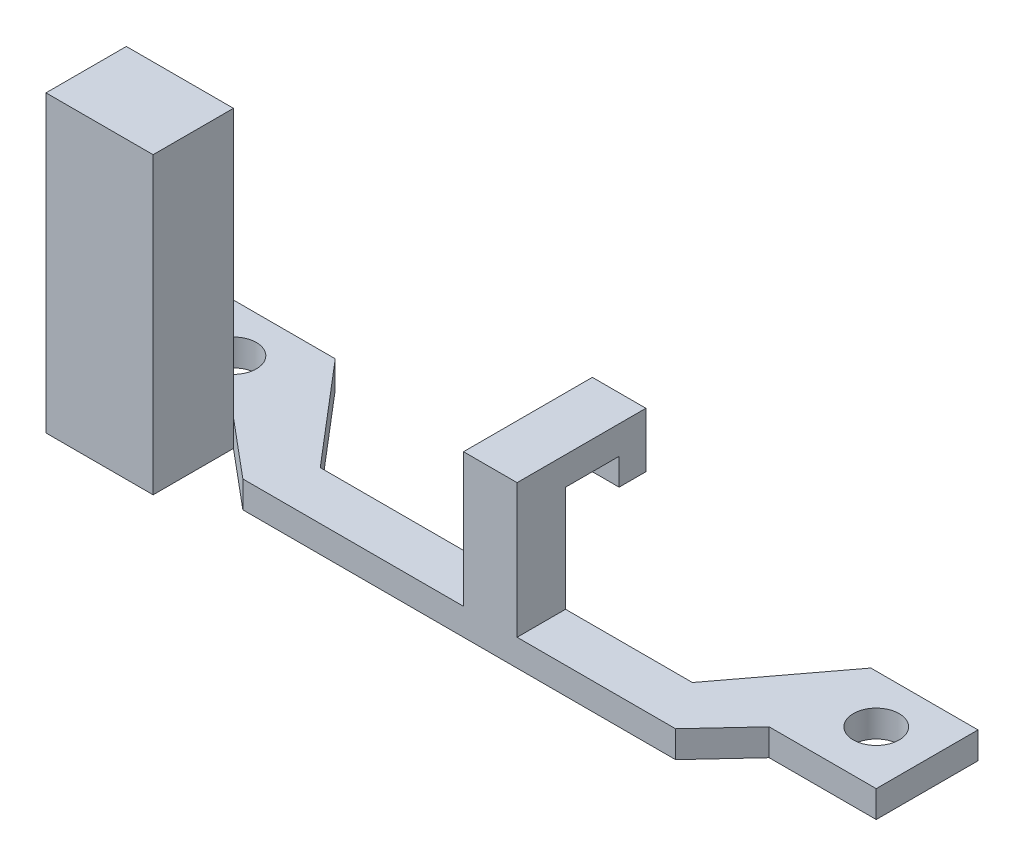
ISO-10303-21;
HEADER;
FILE_DESCRIPTION(('STEP AP214'),'2;1');
FILE_NAME('part.step','',(''),(''),'','','');
FILE_SCHEMA(('AUTOMOTIVE_DESIGN { 1 0 10303 214 1 1 1 1 }'));
ENDSEC;
DATA;
#1=APPLICATION_CONTEXT('core data for automotive mechanical design processes');
#2=APPLICATION_PROTOCOL_DEFINITION('international standard','automotive_design',2000,#1);
#3=PRODUCT_CONTEXT('',#1,'mechanical');
#4=PRODUCT('Part','Part','',(#3));
#5=PRODUCT_RELATED_PRODUCT_CATEGORY('part','',(#4));
#6=PRODUCT_DEFINITION_FORMATION('','',#4);
#7=PRODUCT_DEFINITION_CONTEXT('part definition',#1,'design');
#8=PRODUCT_DEFINITION('design','',#6,#7);
#9=PRODUCT_DEFINITION_SHAPE('','',#8);
#10=(LENGTH_UNIT() NAMED_UNIT(*) SI_UNIT(.MILLI.,.METRE.));
#11=(NAMED_UNIT(*) PLANE_ANGLE_UNIT() SI_UNIT($,.RADIAN.));
#12=(NAMED_UNIT(*) SI_UNIT($,.STERADIAN.) SOLID_ANGLE_UNIT());
#13=UNCERTAINTY_MEASURE_WITH_UNIT(LENGTH_MEASURE(1.E-05),#10,'distance_accuracy_value','');
#14=(GEOMETRIC_REPRESENTATION_CONTEXT(3) GLOBAL_UNCERTAINTY_ASSIGNED_CONTEXT((#13)) GLOBAL_UNIT_ASSIGNED_CONTEXT((#10,
#11,#12)) REPRESENTATION_CONTEXT('',''));
#15=CARTESIAN_POINT('',(0.,0.,0.));
#16=DIRECTION('',(0.,0.,1.));
#17=DIRECTION('',(1.,0.,0.));
#18=AXIS2_PLACEMENT_3D('',#15,#16,#17);
#19=CARTESIAN_POINT('',(0.,2.54,0.));
#20=DIRECTION('',(0.,1.,0.));
#21=DIRECTION('',(0.,0.,1.));
#22=AXIS2_PLACEMENT_3D('',#19,#20,#21);
#23=PLANE('',#22);
#24=CARTESIAN_POINT('',(0.,2.54,0.));
#25=DIRECTION('',(0.,1.,0.));
#26=DIRECTION('',(0.,0.,1.));
#27=AXIS2_PLACEMENT_3D('',#24,#25,#26);
#28=CIRCLE('',#27,2.1717);
#29=CARTESIAN_POINT('',(0.,2.54,2.1717));
#30=VERTEX_POINT('',#29);
#31=EDGE_CURVE('E274',#30,#30,#28,.T.);
#32=ORIENTED_EDGE('',*,*,#31,.F.);
#33=EDGE_LOOP('',(#32));
#34=FACE_BOUND('',#33,.T.);
#35=DIRECTION('',(1.,0.,0.));
#36=VECTOR('',#35,1.);
#37=CARTESIAN_POINT('',(10.5677378951725,2.54,9.67765489472722));
#38=LINE('',#37,#36);
#39=CARTESIAN_POINT('',(10.5677378951725,2.54,9.67765489472722));
#40=VERTEX_POINT('',#39);
#41=CARTESIAN_POINT('',(31.496,2.54,9.67765489472722));
#42=VERTEX_POINT('',#41);
#43=EDGE_CURVE('E63',#40,#42,#38,.T.);
#44=ORIENTED_EDGE('',*,*,#43,.T.);
#45=DIRECTION('',(0.,0.,1.));
#46=VECTOR('',#45,1.);
#47=CARTESIAN_POINT('',(31.496,2.54,5.08));
#48=LINE('',#47,#46);
#49=CARTESIAN_POINT('',(31.496,2.54,5.08));
#50=VERTEX_POINT('',#49);
#51=EDGE_CURVE('E423',#50,#42,#48,.T.);
#52=ORIENTED_EDGE('',*,*,#51,.F.);
#53=DIRECTION('',(-1.,0.,0.));
#54=VECTOR('',#53,1.);
#55=CARTESIAN_POINT('',(13.3093393638717,2.54,5.08));
#56=LINE('',#55,#54);
#57=CARTESIAN_POINT('',(13.3093393638717,2.54,5.08));
#58=VERTEX_POINT('',#57);
#59=EDGE_CURVE('E220',#50,#58,#56,.T.);
#60=ORIENTED_EDGE('',*,*,#59,.T.);
#61=DIRECTION('',(-0.648798322478982,0.,-0.760960404192267));
#62=VECTOR('',#61,1.);
#63=CARTESIAN_POINT('',(5.08,2.54,-4.572));
#64=LINE('',#63,#62);
#65=CARTESIAN_POINT('',(5.08,2.54,-4.572));
#66=VERTEX_POINT('',#65);
#67=EDGE_CURVE('E319',#58,#66,#64,.T.);
#68=ORIENTED_EDGE('',*,*,#67,.T.);
#69=DIRECTION('',(-1.,0.,0.));
#70=VECTOR('',#69,1.);
#71=CARTESIAN_POINT('',(-5.08,2.54,-4.572));
#72=LINE('',#71,#70);
#73=CARTESIAN_POINT('',(-5.08,2.54,-4.572));
#74=VERTEX_POINT('',#73);
#75=EDGE_CURVE('E282',#66,#74,#72,.T.);
#76=ORIENTED_EDGE('',*,*,#75,.T.);
#77=DIRECTION('',(0.,0.,1.));
#78=VECTOR('',#77,1.);
#79=CARTESIAN_POINT('',(-5.08,2.54,5.08));
#80=LINE('',#79,#78);
#81=CARTESIAN_POINT('',(-5.08,2.54,5.08));
#82=VERTEX_POINT('',#81);
#83=EDGE_CURVE('E286',#74,#82,#80,.T.);
#84=ORIENTED_EDGE('',*,*,#83,.T.);
#85=DIRECTION('',(1.,0.,0.));
#86=VECTOR('',#85,1.);
#87=CARTESIAN_POINT('',(0.,2.54,5.08));
#88=LINE('',#87,#86);
#89=CARTESIAN_POINT('',(5.08,2.54,5.08));
#90=VERTEX_POINT('',#89);
#91=EDGE_CURVE('E291',#82,#90,#88,.T.);
#92=ORIENTED_EDGE('',*,*,#91,.T.);
#93=DIRECTION('',(0.766532827702184,0.,0.642205126151211));
#94=VECTOR('',#93,1.);
#95=CARTESIAN_POINT('',(5.08,2.54,5.08));
#96=LINE('',#95,#94);
#97=EDGE_CURVE('E295',#90,#40,#96,.T.);
#98=ORIENTED_EDGE('',*,*,#97,.T.);
#99=EDGE_LOOP('',(#44,#52,#60,#68,#76,#84,#92,#98));
#100=FACE_BOUND('',#99,.T.);
#101=ADVANCED_FACE('F39',(#34,#100),#23,.T.);
#102=CARTESIAN_POINT('',(60.96,2.54,0.));
#103=DIRECTION('',(0.,1.,0.));
#104=DIRECTION('',(0.,0.,1.));
#105=AXIS2_PLACEMENT_3D('',#102,#103,#104);
#106=CIRCLE('',#105,2.1717);
#107=CARTESIAN_POINT('',(60.96,2.54,2.1717));
#108=VERTEX_POINT('',#107);
#109=EDGE_CURVE('E266',#108,#108,#106,.T.);
#110=ORIENTED_EDGE('',*,*,#109,.F.);
#111=EDGE_LOOP('',(#110));
#112=FACE_BOUND('',#111,.T.);
#113=CARTESIAN_POINT('',(48.6074582738638,2.54,5.08));
#114=VERTEX_POINT('',#113);
#115=CARTESIAN_POINT('',(36.576,2.54,5.08));
#116=VERTEX_POINT('',#115);
#117=EDGE_CURVE('E316',#114,#116,#56,.T.);
#118=ORIENTED_EDGE('',*,*,#117,.T.);
#119=DIRECTION('',(0.,0.,-1.));
#120=VECTOR('',#119,1.);
#121=CARTESIAN_POINT('',(36.576,2.54,5.08));
#122=LINE('',#121,#120);
#123=CARTESIAN_POINT('',(36.576,2.54,9.67765489472722));
#124=VERTEX_POINT('',#123);
#125=EDGE_CURVE('E55',#124,#116,#122,.T.);
#126=ORIENTED_EDGE('',*,*,#125,.F.);
#127=CARTESIAN_POINT('',(51.6060848803193,2.54,9.67765489472722));
#128=VERTEX_POINT('',#127);
#129=EDGE_CURVE('E298',#124,#128,#38,.T.);
#130=ORIENTED_EDGE('',*,*,#129,.T.);
#131=DIRECTION('',(0.680849987471262,0.,-0.732422893252513));
#132=VECTOR('',#131,1.);
#133=CARTESIAN_POINT('',(55.88,2.54,5.08));
#134=LINE('',#133,#132);
#135=CARTESIAN_POINT('',(55.88,2.54,5.08));
#136=VERTEX_POINT('',#135);
#137=EDGE_CURVE('E301',#128,#136,#134,.T.);
#138=ORIENTED_EDGE('',*,*,#137,.T.);
#139=DIRECTION('',(1.,0.,0.));
#140=VECTOR('',#139,1.);
#141=CARTESIAN_POINT('',(55.88,2.54,5.08));
#142=LINE('',#141,#140);
#143=CARTESIAN_POINT('',(66.04,2.54,5.08));
#144=VERTEX_POINT('',#143);
#145=EDGE_CURVE('E304',#136,#144,#142,.T.);
#146=ORIENTED_EDGE('',*,*,#145,.T.);
#147=DIRECTION('',(0.,0.,-1.));
#148=VECTOR('',#147,1.);
#149=CARTESIAN_POINT('',(66.04,2.54,5.08));
#150=LINE('',#149,#148);
#151=CARTESIAN_POINT('',(66.04,2.54,-4.572));
#152=VERTEX_POINT('',#151);
#153=EDGE_CURVE('E307',#144,#152,#150,.T.);
#154=ORIENTED_EDGE('',*,*,#153,.T.);
#155=DIRECTION('',(-1.,0.,0.));
#156=VECTOR('',#155,1.);
#157=CARTESIAN_POINT('',(66.04,2.54,-4.572));
#158=LINE('',#157,#156);
#159=CARTESIAN_POINT('',(55.88,2.54,-4.572));
#160=VERTEX_POINT('',#159);
#161=EDGE_CURVE('E310',#152,#160,#158,.T.);
#162=ORIENTED_EDGE('',*,*,#161,.T.);
#163=DIRECTION('',(-0.601774808109118,0.,0.798665812668374));
#164=VECTOR('',#163,1.);
#165=CARTESIAN_POINT('',(48.6074582738638,2.54,5.08));
#166=LINE('',#165,#164);
#167=EDGE_CURVE('E313',#160,#114,#166,.T.);
#168=ORIENTED_EDGE('',*,*,#167,.T.);
#169=EDGE_LOOP('',(#118,#126,#130,#138,#146,#154,#162,#168));
#170=FACE_BOUND('',#169,.T.);
#171=ADVANCED_FACE('F415',(#112,#170),#23,.T.);
#172=CARTESIAN_POINT('',(0.,0.,0.));
#173=DIRECTION('',(0.,1.,0.));
#174=DIRECTION('',(0.,0.,1.));
#175=AXIS2_PLACEMENT_3D('',#172,#173,#174);
#176=PLANE('',#175);
#177=DIRECTION('',(-1.,0.,0.));
#178=VECTOR('',#177,1.);
#179=CARTESIAN_POINT('',(-5.08,0.,-4.572));
#180=LINE('',#179,#178);
#181=CARTESIAN_POINT('',(5.08,0.,-4.572));
#182=VERTEX_POINT('',#181);
#183=CARTESIAN_POINT('',(-5.08,0.,-4.572));
#184=VERTEX_POINT('',#183);
#185=EDGE_CURVE('E278',#182,#184,#180,.T.);
#186=ORIENTED_EDGE('',*,*,#185,.F.);
#187=DIRECTION('',(-0.648798322478982,0.,-0.760960404192267));
#188=VECTOR('',#187,1.);
#189=CARTESIAN_POINT('',(5.08,0.,-4.572));
#190=LINE('',#189,#188);
#191=CARTESIAN_POINT('',(13.3093393638717,0.,5.08));
#192=VERTEX_POINT('',#191);
#193=EDGE_CURVE('E287',#192,#182,#190,.T.);
#194=ORIENTED_EDGE('',*,*,#193,.F.);
#195=DIRECTION('',(-1.,0.,0.));
#196=VECTOR('',#195,1.);
#197=CARTESIAN_POINT('',(13.3093393638717,0.,5.08));
#198=LINE('',#197,#196);
#199=CARTESIAN_POINT('',(48.6074582738638,0.,5.08));
#200=VERTEX_POINT('',#199);
#201=EDGE_CURVE('E351',#200,#192,#198,.T.);
#202=ORIENTED_EDGE('',*,*,#201,.F.);
#203=DIRECTION('',(-0.601774808109118,0.,0.798665812668374));
#204=VECTOR('',#203,1.);
#205=CARTESIAN_POINT('',(48.6074582738638,0.,5.08));
#206=LINE('',#205,#204);
#207=CARTESIAN_POINT('',(55.88,0.,-4.572));
#208=VERTEX_POINT('',#207);
#209=EDGE_CURVE('E348',#208,#200,#206,.T.);
#210=ORIENTED_EDGE('',*,*,#209,.F.);
#211=DIRECTION('',(-1.,0.,0.));
#212=VECTOR('',#211,1.);
#213=CARTESIAN_POINT('',(66.04,0.,-4.572));
#214=LINE('',#213,#212);
#215=CARTESIAN_POINT('',(66.04,0.,-4.572));
#216=VERTEX_POINT('',#215);
#217=EDGE_CURVE('E345',#216,#208,#214,.T.);
#218=ORIENTED_EDGE('',*,*,#217,.F.);
#219=DIRECTION('',(0.,0.,-1.));
#220=VECTOR('',#219,1.);
#221=CARTESIAN_POINT('',(66.04,0.,5.08));
#222=LINE('',#221,#220);
#223=CARTESIAN_POINT('',(66.04,0.,5.08));
#224=VERTEX_POINT('',#223);
#225=EDGE_CURVE('E342',#224,#216,#222,.T.);
#226=ORIENTED_EDGE('',*,*,#225,.F.);
#227=DIRECTION('',(1.,0.,0.));
#228=VECTOR('',#227,1.);
#229=CARTESIAN_POINT('',(60.96,0.,5.08));
#230=LINE('',#229,#228);
#231=CARTESIAN_POINT('',(55.88,0.,5.08));
#232=VERTEX_POINT('',#231);
#233=EDGE_CURVE('E339',#232,#224,#230,.T.);
#234=ORIENTED_EDGE('',*,*,#233,.F.);
#235=DIRECTION('',(0.680849987471262,0.,-0.732422893252513));
#236=VECTOR('',#235,1.);
#237=CARTESIAN_POINT('',(55.88,0.,5.08));
#238=LINE('',#237,#236);
#239=CARTESIAN_POINT('',(51.6060848803193,0.,9.67765489472722));
#240=VERTEX_POINT('',#239);
#241=EDGE_CURVE('E335',#240,#232,#238,.T.);
#242=ORIENTED_EDGE('',*,*,#241,.F.);
#243=DIRECTION('',(1.,0.,0.));
#244=VECTOR('',#243,1.);
#245=CARTESIAN_POINT('',(10.5677378951725,0.,9.67765489472722));
#246=LINE('',#245,#244);
#247=CARTESIAN_POINT('',(10.5677378951725,0.,9.67765489472722));
#248=VERTEX_POINT('',#247);
#249=EDGE_CURVE('E332',#248,#240,#246,.T.);
#250=ORIENTED_EDGE('',*,*,#249,.F.);
#251=DIRECTION('',(0.766532827702184,0.,0.642205126151211));
#252=VECTOR('',#251,1.);
#253=CARTESIAN_POINT('',(5.08,0.,5.08));
#254=LINE('',#253,#252);
#255=CARTESIAN_POINT('',(5.08,0.,5.08));
#256=VERTEX_POINT('',#255);
#257=EDGE_CURVE('E329',#256,#248,#254,.T.);
#258=ORIENTED_EDGE('',*,*,#257,.F.);
#259=DIRECTION('',(0.,0.,-1.));
#260=VECTOR('',#259,1.);
#261=CARTESIAN_POINT('',(5.08,0.,12.7));
#262=LINE('',#261,#260);
#263=CARTESIAN_POINT('',(5.08,0.,12.7));
#264=VERTEX_POINT('',#263);
#265=EDGE_CURVE('E250',#264,#256,#262,.T.);
#266=ORIENTED_EDGE('',*,*,#265,.F.);
#267=DIRECTION('',(1.,0.,0.));
#268=VECTOR('',#267,1.);
#269=CARTESIAN_POINT('',(-5.08,0.,12.7));
#270=LINE('',#269,#268);
#271=CARTESIAN_POINT('',(-5.08,0.,12.7));
#272=VERTEX_POINT('',#271);
#273=EDGE_CURVE('E246',#272,#264,#270,.T.);
#274=ORIENTED_EDGE('',*,*,#273,.F.);
#275=DIRECTION('',(0.,0.,1.));
#276=VECTOR('',#275,1.);
#277=CARTESIAN_POINT('',(-5.08,0.,5.08));
#278=LINE('',#277,#276);
#279=EDGE_CURVE('E326',#184,#272,#278,.T.);
#280=ORIENTED_EDGE('',*,*,#279,.F.);
#281=EDGE_LOOP('',(#186,#194,#202,#210,#218,#226,#234,#242,#250,#258,#266,#274,#280));
#282=FACE_BOUND('',#281,.T.);
#283=CARTESIAN_POINT('',(0.,0.,0.));
#284=DIRECTION('',(0.,1.,0.));
#285=DIRECTION('',(0.,0.,1.));
#286=AXIS2_PLACEMENT_3D('',#283,#284,#285);
#287=CIRCLE('',#286,2.1717);
#288=CARTESIAN_POINT('',(0.,0.,2.1717));
#289=VERTEX_POINT('',#288);
#290=EDGE_CURVE('E270',#289,#289,#287,.T.);
#291=ORIENTED_EDGE('',*,*,#290,.T.);
#292=EDGE_LOOP('',(#291));
#293=FACE_BOUND('',#292,.T.);
#294=CARTESIAN_POINT('',(60.96,0.,0.));
#295=DIRECTION('',(0.,1.,0.));
#296=DIRECTION('',(0.,0.,1.));
#297=AXIS2_PLACEMENT_3D('',#294,#295,#296);
#298=CIRCLE('',#297,2.1717);
#299=CARTESIAN_POINT('',(60.96,0.,2.1717));
#300=VERTEX_POINT('',#299);
#301=EDGE_CURVE('E257',#300,#300,#298,.T.);
#302=ORIENTED_EDGE('',*,*,#301,.T.);
#303=EDGE_LOOP('',(#302));
#304=FACE_BOUND('',#303,.T.);
#305=ADVANCED_FACE('F403',(#282,#293,#304),#176,.F.);
#306=CARTESIAN_POINT('',(-5.08,2.54,-4.572));
#307=DIRECTION('',(0.,0.,1.));
#308=DIRECTION('',(1.,0.,0.));
#309=AXIS2_PLACEMENT_3D('',#306,#307,#308);
#310=PLANE('',#309);
#311=ORIENTED_EDGE('',*,*,#185,.T.);
#312=DIRECTION('',(0.,-1.,0.));
#313=VECTOR('',#312,1.);
#314=CARTESIAN_POINT('',(-5.08,2.54,-4.572));
#315=LINE('',#314,#313);
#316=EDGE_CURVE('E11',#74,#184,#315,.T.);
#317=ORIENTED_EDGE('',*,*,#316,.F.);
#318=ORIENTED_EDGE('',*,*,#75,.F.);
#319=DIRECTION('',(0.,-1.,0.));
#320=VECTOR('',#319,1.);
#321=CARTESIAN_POINT('',(5.08,2.54,-4.572));
#322=LINE('',#321,#320);
#323=EDGE_CURVE('E322',#66,#182,#322,.T.);
#324=ORIENTED_EDGE('',*,*,#323,.T.);
#325=EDGE_LOOP('',(#311,#317,#318,#324));
#326=FACE_BOUND('',#325,.T.);
#327=ADVANCED_FACE('F41',(#326),#310,.F.);
#328=CARTESIAN_POINT('',(-5.08,2.54,5.08));
#329=DIRECTION('',(1.,0.,0.));
#330=DIRECTION('',(0.,0.,-1.));
#331=AXIS2_PLACEMENT_3D('',#328,#329,#330);
#332=PLANE('',#331);
#333=ORIENTED_EDGE('',*,*,#279,.T.);
#334=DIRECTION('',(0.,1.,0.));
#335=VECTOR('',#334,1.);
#336=CARTESIAN_POINT('',(-5.08,0.,12.7));
#337=LINE('',#336,#335);
#338=CARTESIAN_POINT('',(-5.08,27.94,12.7));
#339=VERTEX_POINT('',#338);
#340=EDGE_CURVE('E261',#272,#339,#337,.T.);
#341=ORIENTED_EDGE('',*,*,#340,.T.);
#342=DIRECTION('',(0.,0.,1.));
#343=VECTOR('',#342,1.);
#344=CARTESIAN_POINT('',(-5.08,27.94,5.08));
#345=LINE('',#344,#343);
#346=CARTESIAN_POINT('',(-5.08,27.94,5.08));
#347=VERTEX_POINT('',#346);
#348=EDGE_CURVE('E228',#347,#339,#345,.T.);
#349=ORIENTED_EDGE('',*,*,#348,.F.);
#350=DIRECTION('',(0.,1.,0.));
#351=VECTOR('',#350,1.);
#352=CARTESIAN_POINT('',(-5.08,0.,5.08));
#353=LINE('',#352,#351);
#354=EDGE_CURVE('E253',#82,#347,#353,.T.);
#355=ORIENTED_EDGE('',*,*,#354,.F.);
#356=ORIENTED_EDGE('',*,*,#83,.F.);
#357=ORIENTED_EDGE('',*,*,#316,.T.);
#358=EDGE_LOOP('',(#333,#341,#349,#355,#356,#357));
#359=FACE_BOUND('',#358,.T.);
#360=ADVANCED_FACE('F433',(#359),#332,.F.);
#361=CARTESIAN_POINT('',(5.08,2.54,5.08));
#362=DIRECTION('',(0.642205126151211,0.,-0.766532827702184));
#363=DIRECTION('',(-0.766532827702184,0.,-0.642205126151211));
#364=AXIS2_PLACEMENT_3D('',#361,#362,#363);
#365=PLANE('',#364);
#366=ORIENTED_EDGE('',*,*,#257,.T.);
#367=DIRECTION('',(0.,-1.,0.));
#368=VECTOR('',#367,1.);
#369=CARTESIAN_POINT('',(10.5677378951725,2.54,9.67765489472722));
#370=LINE('',#369,#368);
#371=EDGE_CURVE('E387',#40,#248,#370,.T.);
#372=ORIENTED_EDGE('',*,*,#371,.F.);
#373=ORIENTED_EDGE('',*,*,#97,.F.);
#374=DIRECTION('',(0.,-1.,0.));
#375=VECTOR('',#374,1.);
#376=CARTESIAN_POINT('',(5.08,2.54,5.08));
#377=LINE('',#376,#375);
#378=EDGE_CURVE('E48',#90,#256,#377,.T.);
#379=ORIENTED_EDGE('',*,*,#378,.T.);
#380=EDGE_LOOP('',(#366,#372,#373,#379));
#381=FACE_BOUND('',#380,.T.);
#382=ADVANCED_FACE('F396',(#381),#365,.F.);
#383=CARTESIAN_POINT('',(10.5677378951725,2.54,9.67765489472722));
#384=DIRECTION('',(0.,0.,-1.));
#385=DIRECTION('',(-1.,0.,0.));
#386=AXIS2_PLACEMENT_3D('',#383,#384,#385);
#387=PLANE('',#386);
#388=ORIENTED_EDGE('',*,*,#249,.T.);
#389=DIRECTION('',(0.,-1.,0.));
#390=VECTOR('',#389,1.);
#391=CARTESIAN_POINT('',(51.6060848803193,2.54,9.67765489472722));
#392=LINE('',#391,#390);
#393=EDGE_CURVE('E383',#128,#240,#392,.T.);
#394=ORIENTED_EDGE('',*,*,#393,.F.);
#395=ORIENTED_EDGE('',*,*,#129,.F.);
#396=DIRECTION('',(0.,-1.,0.));
#397=VECTOR('',#396,1.);
#398=CARTESIAN_POINT('',(36.576,15.24,9.67765489472722));
#399=LINE('',#398,#397);
#400=CARTESIAN_POINT('',(36.576,15.24,9.67765489472722));
#401=VERTEX_POINT('',#400);
#402=EDGE_CURVE('E231',#401,#124,#399,.T.);
#403=ORIENTED_EDGE('',*,*,#402,.F.);
#404=DIRECTION('',(1.,0.,0.));
#405=VECTOR('',#404,1.);
#406=CARTESIAN_POINT('',(31.496,15.24,9.67765489472722));
#407=LINE('',#406,#405);
#408=CARTESIAN_POINT('',(31.496,15.24,9.67765489472722));
#409=VERTEX_POINT('',#408);
#410=EDGE_CURVE('E464',#409,#401,#407,.T.);
#411=ORIENTED_EDGE('',*,*,#410,.F.);
#412=DIRECTION('',(0.,-1.,0.));
#413=VECTOR('',#412,1.);
#414=CARTESIAN_POINT('',(31.496,15.24,9.67765489472722));
#415=LINE('',#414,#413);
#416=EDGE_CURVE('E223',#409,#42,#415,.T.);
#417=ORIENTED_EDGE('',*,*,#416,.T.);
#418=ORIENTED_EDGE('',*,*,#43,.F.);
#419=ORIENTED_EDGE('',*,*,#371,.T.);
#420=EDGE_LOOP('',(#388,#394,#395,#403,#411,#417,#418,#419));
#421=FACE_BOUND('',#420,.T.);
#422=ADVANCED_FACE('F409',(#421),#387,.F.);
#423=CARTESIAN_POINT('',(55.88,2.54,5.08));
#424=DIRECTION('',(-0.732422893252513,0.,-0.680849987471263));
#425=DIRECTION('',(-0.680849987471263,0.,0.732422893252513));
#426=AXIS2_PLACEMENT_3D('',#423,#424,#425);
#427=PLANE('',#426);
#428=ORIENTED_EDGE('',*,*,#241,.T.);
#429=DIRECTION('',(0.,-1.,0.));
#430=VECTOR('',#429,1.);
#431=CARTESIAN_POINT('',(55.88,2.54,5.08));
#432=LINE('',#431,#430);
#433=EDGE_CURVE('E379',#136,#232,#432,.T.);
#434=ORIENTED_EDGE('',*,*,#433,.F.);
#435=ORIENTED_EDGE('',*,*,#137,.F.);
#436=ORIENTED_EDGE('',*,*,#393,.T.);
#437=EDGE_LOOP('',(#428,#434,#435,#436));
#438=FACE_BOUND('',#437,.T.);
#439=ADVANCED_FACE('F412',(#438),#427,.F.);
#440=CARTESIAN_POINT('',(60.96,2.54,5.08));
#441=DIRECTION('',(0.,0.,-1.));
#442=DIRECTION('',(-1.,0.,0.));
#443=AXIS2_PLACEMENT_3D('',#440,#441,#442);
#444=PLANE('',#443);
#445=ORIENTED_EDGE('',*,*,#233,.T.);
#446=DIRECTION('',(0.,-1.,0.));
#447=VECTOR('',#446,1.);
#448=CARTESIAN_POINT('',(66.04,2.54,5.08));
#449=LINE('',#448,#447);
#450=EDGE_CURVE('E375',#144,#224,#449,.T.);
#451=ORIENTED_EDGE('',*,*,#450,.F.);
#452=ORIENTED_EDGE('',*,*,#145,.F.);
#453=ORIENTED_EDGE('',*,*,#433,.T.);
#454=EDGE_LOOP('',(#445,#451,#452,#453));
#455=FACE_BOUND('',#454,.T.);
#456=ADVANCED_FACE('F560',(#455),#444,.F.);
#457=CARTESIAN_POINT('',(66.04,2.54,5.08));
#458=DIRECTION('',(-1.,0.,0.));
#459=DIRECTION('',(0.,0.,1.));
#460=AXIS2_PLACEMENT_3D('',#457,#458,#459);
#461=PLANE('',#460);
#462=ORIENTED_EDGE('',*,*,#225,.T.);
#463=DIRECTION('',(0.,-1.,0.));
#464=VECTOR('',#463,1.);
#465=CARTESIAN_POINT('',(66.04,2.54,-4.572));
#466=LINE('',#465,#464);
#467=EDGE_CURVE('E371',#152,#216,#466,.T.);
#468=ORIENTED_EDGE('',*,*,#467,.F.);
#469=ORIENTED_EDGE('',*,*,#153,.F.);
#470=ORIENTED_EDGE('',*,*,#450,.T.);
#471=EDGE_LOOP('',(#462,#468,#469,#470));
#472=FACE_BOUND('',#471,.T.);
#473=ADVANCED_FACE('F556',(#472),#461,.F.);
#474=CARTESIAN_POINT('',(66.04,2.54,-4.572));
#475=DIRECTION('',(0.,0.,1.));
#476=DIRECTION('',(1.,0.,0.));
#477=AXIS2_PLACEMENT_3D('',#474,#475,#476);
#478=PLANE('',#477);
#479=ORIENTED_EDGE('',*,*,#217,.T.);
#480=DIRECTION('',(0.,-1.,0.));
#481=VECTOR('',#480,1.);
#482=CARTESIAN_POINT('',(55.88,2.54,-4.572));
#483=LINE('',#482,#481);
#484=EDGE_CURVE('E367',#160,#208,#483,.T.);
#485=ORIENTED_EDGE('',*,*,#484,.F.);
#486=ORIENTED_EDGE('',*,*,#161,.F.);
#487=ORIENTED_EDGE('',*,*,#467,.T.);
#488=EDGE_LOOP('',(#479,#485,#486,#487));
#489=FACE_BOUND('',#488,.T.);
#490=ADVANCED_FACE('F553',(#489),#478,.F.);
#491=CARTESIAN_POINT('',(48.6074582738638,2.54,5.08));
#492=DIRECTION('',(0.798665812668374,0.,0.601774808109118));
#493=DIRECTION('',(0.601774808109118,0.,-0.798665812668374));
#494=AXIS2_PLACEMENT_3D('',#491,#492,#493);
#495=PLANE('',#494);
#496=ORIENTED_EDGE('',*,*,#209,.T.);
#497=DIRECTION('',(0.,-1.,0.));
#498=VECTOR('',#497,1.);
#499=CARTESIAN_POINT('',(48.6074582738638,2.54,5.08));
#500=LINE('',#499,#498);
#501=EDGE_CURVE('E363',#114,#200,#500,.T.);
#502=ORIENTED_EDGE('',*,*,#501,.F.);
#503=ORIENTED_EDGE('',*,*,#167,.F.);
#504=ORIENTED_EDGE('',*,*,#484,.T.);
#505=EDGE_LOOP('',(#496,#502,#503,#504));
#506=FACE_BOUND('',#505,.T.);
#507=ADVANCED_FACE('F451',(#506),#495,.F.);
#508=CARTESIAN_POINT('',(13.3093393638717,2.54,5.08));
#509=DIRECTION('',(0.,0.,1.));
#510=DIRECTION('',(1.,0.,0.));
#511=AXIS2_PLACEMENT_3D('',#508,#509,#510);
#512=PLANE('',#511);
#513=DIRECTION('',(0.,-1.,0.));
#514=VECTOR('',#513,1.);
#515=CARTESIAN_POINT('',(31.496,15.24,5.08));
#516=LINE('',#515,#514);
#517=CARTESIAN_POINT('',(31.496,12.5662337869417,5.08));
#518=VERTEX_POINT('',#517);
#519=EDGE_CURVE('E210',#518,#50,#516,.T.);
#520=ORIENTED_EDGE('',*,*,#519,.F.);
#521=DIRECTION('',(1.,0.,0.));
#522=VECTOR('',#521,1.);
#523=CARTESIAN_POINT('',(31.496,12.5662337869417,5.08));
#524=LINE('',#523,#522);
#525=CARTESIAN_POINT('',(36.576,12.5662337869417,5.08));
#526=VERTEX_POINT('',#525);
#527=EDGE_CURVE('E194',#518,#526,#524,.T.);
#528=ORIENTED_EDGE('',*,*,#527,.T.);
#529=DIRECTION('',(0.,-1.,0.));
#530=VECTOR('',#529,1.);
#531=CARTESIAN_POINT('',(36.576,15.24,5.08));
#532=LINE('',#531,#530);
#533=EDGE_CURVE('E455',#526,#116,#532,.T.);
#534=ORIENTED_EDGE('',*,*,#533,.T.);
#535=ORIENTED_EDGE('',*,*,#117,.F.);
#536=ORIENTED_EDGE('',*,*,#501,.T.);
#537=ORIENTED_EDGE('',*,*,#201,.T.);
#538=DIRECTION('',(0.,-1.,0.));
#539=VECTOR('',#538,1.);
#540=CARTESIAN_POINT('',(13.3093393638717,2.54,5.08));
#541=LINE('',#540,#539);
#542=EDGE_CURVE('E359',#58,#192,#541,.T.);
#543=ORIENTED_EDGE('',*,*,#542,.F.);
#544=ORIENTED_EDGE('',*,*,#59,.F.);
#545=EDGE_LOOP('',(#520,#528,#534,#535,#536,#537,#543,#544));
#546=FACE_BOUND('',#545,.T.);
#547=ADVANCED_FACE('F218',(#546),#512,.F.);
#548=CARTESIAN_POINT('',(5.08,2.54,-4.572));
#549=DIRECTION('',(-0.760960404192267,0.,0.648798322478982));
#550=DIRECTION('',(0.648798322478982,0.,0.760960404192267));
#551=AXIS2_PLACEMENT_3D('',#548,#549,#550);
#552=PLANE('',#551);
#553=ORIENTED_EDGE('',*,*,#193,.T.);
#554=ORIENTED_EDGE('',*,*,#323,.F.);
#555=ORIENTED_EDGE('',*,*,#67,.F.);
#556=ORIENTED_EDGE('',*,*,#542,.T.);
#557=EDGE_LOOP('',(#553,#554,#555,#556));
#558=FACE_BOUND('',#557,.T.);
#559=ADVANCED_FACE('F427',(#558),#552,.F.);
#560=CARTESIAN_POINT('',(0.,2.54,0.));
#561=DIRECTION('',(0.,-1.,0.));
#562=DIRECTION('',(0.,0.,-1.));
#563=AXIS2_PLACEMENT_3D('',#560,#561,#562);
#564=CYLINDRICAL_SURFACE('',#563,2.1717);
#565=ORIENTED_EDGE('',*,*,#31,.T.);
#566=EDGE_LOOP('',(#565));
#567=FACE_BOUND('',#566,.T.);
#568=ORIENTED_EDGE('',*,*,#290,.F.);
#569=EDGE_LOOP('',(#568));
#570=FACE_BOUND('',#569,.T.);
#571=ADVANCED_FACE('F543',(#567,#570),#564,.F.);
#572=CARTESIAN_POINT('',(60.96,2.54,0.));
#573=DIRECTION('',(0.,-1.,0.));
#574=DIRECTION('',(0.,0.,-1.));
#575=AXIS2_PLACEMENT_3D('',#572,#573,#574);
#576=CYLINDRICAL_SURFACE('',#575,2.1717);
#577=ORIENTED_EDGE('',*,*,#109,.T.);
#578=EDGE_LOOP('',(#577));
#579=FACE_BOUND('',#578,.T.);
#580=ORIENTED_EDGE('',*,*,#301,.F.);
#581=EDGE_LOOP('',(#580));
#582=FACE_BOUND('',#581,.T.);
#583=ADVANCED_FACE('F684',(#579,#582),#576,.F.);
#584=CARTESIAN_POINT('',(5.08,0.,5.08));
#585=DIRECTION('',(0.,0.,-1.));
#586=DIRECTION('',(-1.,0.,0.));
#587=AXIS2_PLACEMENT_3D('',#584,#585,#586);
#588=PLANE('',#587);
#589=DIRECTION('',(0.,1.,0.));
#590=VECTOR('',#589,1.);
#591=CARTESIAN_POINT('',(5.08,0.,5.08));
#592=LINE('',#591,#590);
#593=CARTESIAN_POINT('',(5.08,27.94,5.08));
#594=VERTEX_POINT('',#593);
#595=EDGE_CURVE('E254',#90,#594,#592,.T.);
#596=ORIENTED_EDGE('',*,*,#595,.F.);
#597=ORIENTED_EDGE('',*,*,#91,.F.);
#598=ORIENTED_EDGE('',*,*,#354,.T.);
#599=DIRECTION('',(-1.,0.,0.));
#600=VECTOR('',#599,1.);
#601=CARTESIAN_POINT('',(5.08,27.94,5.08));
#602=LINE('',#601,#600);
#603=EDGE_CURVE('E222',#594,#347,#602,.T.);
#604=ORIENTED_EDGE('',*,*,#603,.F.);
#605=EDGE_LOOP('',(#596,#597,#598,#604));
#606=FACE_BOUND('',#605,.T.);
#607=ADVANCED_FACE('F437',(#606),#588,.T.);
#608=CARTESIAN_POINT('',(5.08,0.,12.7));
#609=DIRECTION('',(1.,0.,0.));
#610=DIRECTION('',(0.,0.,-1.));
#611=AXIS2_PLACEMENT_3D('',#608,#609,#610);
#612=PLANE('',#611);
#613=ORIENTED_EDGE('',*,*,#378,.F.);
#614=ORIENTED_EDGE('',*,*,#595,.T.);
#615=DIRECTION('',(0.,0.,-1.));
#616=VECTOR('',#615,1.);
#617=CARTESIAN_POINT('',(5.08,27.94,12.7));
#618=LINE('',#617,#616);
#619=CARTESIAN_POINT('',(5.08,27.94,12.7));
#620=VERTEX_POINT('',#619);
#621=EDGE_CURVE('E242',#620,#594,#618,.T.);
#622=ORIENTED_EDGE('',*,*,#621,.F.);
#623=DIRECTION('',(0.,1.,0.));
#624=VECTOR('',#623,1.);
#625=CARTESIAN_POINT('',(5.08,0.,12.7));
#626=LINE('',#625,#624);
#627=EDGE_CURVE('E258',#264,#620,#626,.T.);
#628=ORIENTED_EDGE('',*,*,#627,.F.);
#629=ORIENTED_EDGE('',*,*,#265,.T.);
#630=EDGE_LOOP('',(#613,#614,#622,#628,#629));
#631=FACE_BOUND('',#630,.T.);
#632=ADVANCED_FACE('F439',(#631),#612,.T.);
#633=CARTESIAN_POINT('',(-5.08,0.,12.7));
#634=DIRECTION('',(0.,0.,1.));
#635=DIRECTION('',(1.,0.,0.));
#636=AXIS2_PLACEMENT_3D('',#633,#634,#635);
#637=PLANE('',#636);
#638=ORIENTED_EDGE('',*,*,#627,.T.);
#639=DIRECTION('',(1.,0.,0.));
#640=VECTOR('',#639,1.);
#641=CARTESIAN_POINT('',(-5.08,27.94,12.7));
#642=LINE('',#641,#640);
#643=EDGE_CURVE('E238',#339,#620,#642,.T.);
#644=ORIENTED_EDGE('',*,*,#643,.F.);
#645=ORIENTED_EDGE('',*,*,#340,.F.);
#646=ORIENTED_EDGE('',*,*,#273,.T.);
#647=EDGE_LOOP('',(#638,#644,#645,#646));
#648=FACE_BOUND('',#647,.T.);
#649=ADVANCED_FACE('F445',(#648),#637,.T.);
#650=CARTESIAN_POINT('',(0.,27.94,0.));
#651=DIRECTION('',(0.,1.,0.));
#652=DIRECTION('',(0.,0.,1.));
#653=AXIS2_PLACEMENT_3D('',#650,#651,#652);
#654=PLANE('',#653);
#655=ORIENTED_EDGE('',*,*,#603,.T.);
#656=ORIENTED_EDGE('',*,*,#348,.T.);
#657=ORIENTED_EDGE('',*,*,#643,.T.);
#658=ORIENTED_EDGE('',*,*,#621,.T.);
#659=EDGE_LOOP('',(#655,#656,#657,#658));
#660=FACE_BOUND('',#659,.T.);
#661=ADVANCED_FACE('F441',(#660),#654,.T.);
#662=CARTESIAN_POINT('',(31.496,15.24,5.08));
#663=DIRECTION('',(1.,0.,0.));
#664=DIRECTION('',(0.,0.,-1.));
#665=AXIS2_PLACEMENT_3D('',#662,#663,#664);
#666=PLANE('',#665);
#667=ORIENTED_EDGE('',*,*,#51,.T.);
#668=ORIENTED_EDGE('',*,*,#416,.F.);
#669=DIRECTION('',(0.,0.,1.));
#670=VECTOR('',#669,1.);
#671=CARTESIAN_POINT('',(31.496,15.24,5.08));
#672=LINE('',#671,#670);
#673=CARTESIAN_POINT('',(31.496,15.24,-2.54));
#674=VERTEX_POINT('',#673);
#675=EDGE_CURVE('E460',#674,#409,#672,.T.);
#676=ORIENTED_EDGE('',*,*,#675,.F.);
#677=DIRECTION('',(0.,1.,0.));
#678=VECTOR('',#677,1.);
#679=CARTESIAN_POINT('',(31.496,15.24,-2.54));
#680=LINE('',#679,#678);
#681=CARTESIAN_POINT('',(31.496,10.0262337869417,-2.54));
#682=VERTEX_POINT('',#681);
#683=EDGE_CURVE('E205',#682,#674,#680,.T.);
#684=ORIENTED_EDGE('',*,*,#683,.F.);
#685=DIRECTION('',(0.,0.,-1.));
#686=VECTOR('',#685,1.);
#687=CARTESIAN_POINT('',(31.496,10.0262337869417,-2.54));
#688=LINE('',#687,#686);
#689=CARTESIAN_POINT('',(31.496,10.0262337869417,0.));
#690=VERTEX_POINT('',#689);
#691=EDGE_CURVE('E506',#690,#682,#688,.T.);
#692=ORIENTED_EDGE('',*,*,#691,.F.);
#693=DIRECTION('',(0.,-1.,0.));
#694=VECTOR('',#693,1.);
#695=CARTESIAN_POINT('',(31.496,10.0262337869417,0.));
#696=LINE('',#695,#694);
#697=CARTESIAN_POINT('',(31.496,12.5662337869417,0.));
#698=VERTEX_POINT('',#697);
#699=EDGE_CURVE('E214',#698,#690,#696,.T.);
#700=ORIENTED_EDGE('',*,*,#699,.F.);
#701=DIRECTION('',(0.,0.,-1.));
#702=VECTOR('',#701,1.);
#703=CARTESIAN_POINT('',(31.496,12.5662337869417,0.));
#704=LINE('',#703,#702);
#705=EDGE_CURVE('E197',#518,#698,#704,.T.);
#706=ORIENTED_EDGE('',*,*,#705,.F.);
#707=ORIENTED_EDGE('',*,*,#519,.T.);
#708=EDGE_LOOP('',(#667,#668,#676,#684,#692,#700,#706,#707));
#709=FACE_BOUND('',#708,.T.);
#710=ADVANCED_FACE('F209',(#709),#666,.F.);
#711=CARTESIAN_POINT('',(36.576,15.24,5.08));
#712=DIRECTION('',(-1.,0.,0.));
#713=DIRECTION('',(0.,0.,1.));
#714=AXIS2_PLACEMENT_3D('',#711,#712,#713);
#715=PLANE('',#714);
#716=ORIENTED_EDGE('',*,*,#125,.T.);
#717=ORIENTED_EDGE('',*,*,#533,.F.);
#718=DIRECTION('',(0.,0.,-1.));
#719=VECTOR('',#718,1.);
#720=CARTESIAN_POINT('',(36.576,12.5662337869417,0.));
#721=LINE('',#720,#719);
#722=CARTESIAN_POINT('',(36.576,12.5662337869417,0.));
#723=VERTEX_POINT('',#722);
#724=EDGE_CURVE('E199',#526,#723,#721,.T.);
#725=ORIENTED_EDGE('',*,*,#724,.T.);
#726=DIRECTION('',(0.,-1.,0.));
#727=VECTOR('',#726,1.);
#728=CARTESIAN_POINT('',(36.576,10.0262337869417,0.));
#729=LINE('',#728,#727);
#730=CARTESIAN_POINT('',(36.576,10.0262337869417,0.));
#731=VERTEX_POINT('',#730);
#732=EDGE_CURVE('E497',#723,#731,#729,.T.);
#733=ORIENTED_EDGE('',*,*,#732,.T.);
#734=DIRECTION('',(0.,0.,-1.));
#735=VECTOR('',#734,1.);
#736=CARTESIAN_POINT('',(36.576,10.0262337869417,-2.54));
#737=LINE('',#736,#735);
#738=CARTESIAN_POINT('',(36.576,10.0262337869417,-2.54));
#739=VERTEX_POINT('',#738);
#740=EDGE_CURVE('E493',#731,#739,#737,.T.);
#741=ORIENTED_EDGE('',*,*,#740,.T.);
#742=DIRECTION('',(0.,1.,0.));
#743=VECTOR('',#742,1.);
#744=CARTESIAN_POINT('',(36.576,15.24,-2.54));
#745=LINE('',#744,#743);
#746=CARTESIAN_POINT('',(36.576,15.24,-2.54));
#747=VERTEX_POINT('',#746);
#748=EDGE_CURVE('E216',#739,#747,#745,.T.);
#749=ORIENTED_EDGE('',*,*,#748,.T.);
#750=DIRECTION('',(0.,0.,-1.));
#751=VECTOR('',#750,1.);
#752=CARTESIAN_POINT('',(36.576,15.24,5.08));
#753=LINE('',#752,#751);
#754=EDGE_CURVE('E471',#401,#747,#753,.T.);
#755=ORIENTED_EDGE('',*,*,#754,.F.);
#756=ORIENTED_EDGE('',*,*,#402,.T.);
#757=EDGE_LOOP('',(#716,#717,#725,#733,#741,#749,#755,#756));
#758=FACE_BOUND('',#757,.T.);
#759=ADVANCED_FACE('F457',(#758),#715,.F.);
#760=CARTESIAN_POINT('',(0.,15.24,0.));
#761=DIRECTION('',(0.,-1.,0.));
#762=DIRECTION('',(0.,0.,-1.));
#763=AXIS2_PLACEMENT_3D('',#760,#761,#762);
#764=PLANE('',#763);
#765=ORIENTED_EDGE('',*,*,#754,.T.);
#766=DIRECTION('',(1.,0.,0.));
#767=VECTOR('',#766,1.);
#768=CARTESIAN_POINT('',(31.496,15.24,-2.54));
#769=LINE('',#768,#767);
#770=EDGE_CURVE('E466',#674,#747,#769,.T.);
#771=ORIENTED_EDGE('',*,*,#770,.F.);
#772=ORIENTED_EDGE('',*,*,#675,.T.);
#773=ORIENTED_EDGE('',*,*,#410,.T.);
#774=EDGE_LOOP('',(#765,#771,#772,#773));
#775=FACE_BOUND('',#774,.T.);
#776=ADVANCED_FACE('F522',(#775),#764,.F.);
#777=CARTESIAN_POINT('',(31.496,15.24,-2.54));
#778=DIRECTION('',(0.,0.,-1.));
#779=DIRECTION('',(-1.,0.,0.));
#780=AXIS2_PLACEMENT_3D('',#777,#778,#779);
#781=PLANE('',#780);
#782=ORIENTED_EDGE('',*,*,#748,.F.);
#783=DIRECTION('',(1.,0.,0.));
#784=VECTOR('',#783,1.);
#785=CARTESIAN_POINT('',(31.496,10.0262337869417,-2.54));
#786=LINE('',#785,#784);
#787=EDGE_CURVE('E484',#682,#739,#786,.T.);
#788=ORIENTED_EDGE('',*,*,#787,.F.);
#789=ORIENTED_EDGE('',*,*,#683,.T.);
#790=ORIENTED_EDGE('',*,*,#770,.T.);
#791=EDGE_LOOP('',(#782,#788,#789,#790));
#792=FACE_BOUND('',#791,.T.);
#793=ADVANCED_FACE('F520',(#792),#781,.T.);
#794=CARTESIAN_POINT('',(31.496,10.0262337869417,-2.54));
#795=DIRECTION('',(0.,-1.,0.));
#796=DIRECTION('',(0.,0.,-1.));
#797=AXIS2_PLACEMENT_3D('',#794,#795,#796);
#798=PLANE('',#797);
#799=ORIENTED_EDGE('',*,*,#740,.F.);
#800=DIRECTION('',(1.,0.,0.));
#801=VECTOR('',#800,1.);
#802=CARTESIAN_POINT('',(31.496,10.0262337869417,0.));
#803=LINE('',#802,#801);
#804=EDGE_CURVE('E481',#690,#731,#803,.T.);
#805=ORIENTED_EDGE('',*,*,#804,.F.);
#806=ORIENTED_EDGE('',*,*,#691,.T.);
#807=ORIENTED_EDGE('',*,*,#787,.T.);
#808=EDGE_LOOP('',(#799,#805,#806,#807));
#809=FACE_BOUND('',#808,.T.);
#810=ADVANCED_FACE('F517',(#809),#798,.T.);
#811=CARTESIAN_POINT('',(31.496,10.0262337869417,0.));
#812=DIRECTION('',(0.,0.,1.));
#813=DIRECTION('',(0.,-1.,0.));
#814=AXIS2_PLACEMENT_3D('',#811,#812,#813);
#815=PLANE('',#814);
#816=ORIENTED_EDGE('',*,*,#732,.F.);
#817=DIRECTION('',(1.,0.,0.));
#818=VECTOR('',#817,1.);
#819=CARTESIAN_POINT('',(31.496,12.5662337869417,0.));
#820=LINE('',#819,#818);
#821=EDGE_CURVE('E204',#698,#723,#820,.T.);
#822=ORIENTED_EDGE('',*,*,#821,.F.);
#823=ORIENTED_EDGE('',*,*,#699,.T.);
#824=ORIENTED_EDGE('',*,*,#804,.T.);
#825=EDGE_LOOP('',(#816,#822,#823,#824));
#826=FACE_BOUND('',#825,.T.);
#827=ADVANCED_FACE('F513',(#826),#815,.T.);
#828=CARTESIAN_POINT('',(31.496,12.5662337869417,0.));
#829=DIRECTION('',(0.,-1.,0.));
#830=DIRECTION('',(0.,0.,-1.));
#831=AXIS2_PLACEMENT_3D('',#828,#829,#830);
#832=PLANE('',#831);
#833=ORIENTED_EDGE('',*,*,#724,.F.);
#834=ORIENTED_EDGE('',*,*,#527,.F.);
#835=ORIENTED_EDGE('',*,*,#705,.T.);
#836=ORIENTED_EDGE('',*,*,#821,.T.);
#837=EDGE_LOOP('',(#833,#834,#835,#836));
#838=FACE_BOUND('',#837,.T.);
#839=ADVANCED_FACE('F196',(#838),#832,.T.);
#840=CLOSED_SHELL('',(#101,#171,#305,#327,#360,#382,#422,#439,#456,#473,#490,#507,#547,#559,
#571,#583,#607,#632,#649,#661,#710,#759,#776,#793,#810,#827,#839));
#841=MANIFOLD_SOLID_BREP('B2',#840);
#842=ADVANCED_BREP_SHAPE_REPRESENTATION('',(#18,#841),#14);
#843=SHAPE_DEFINITION_REPRESENTATION(#9,#842);
ENDSEC;
END-ISO-10303-21;
